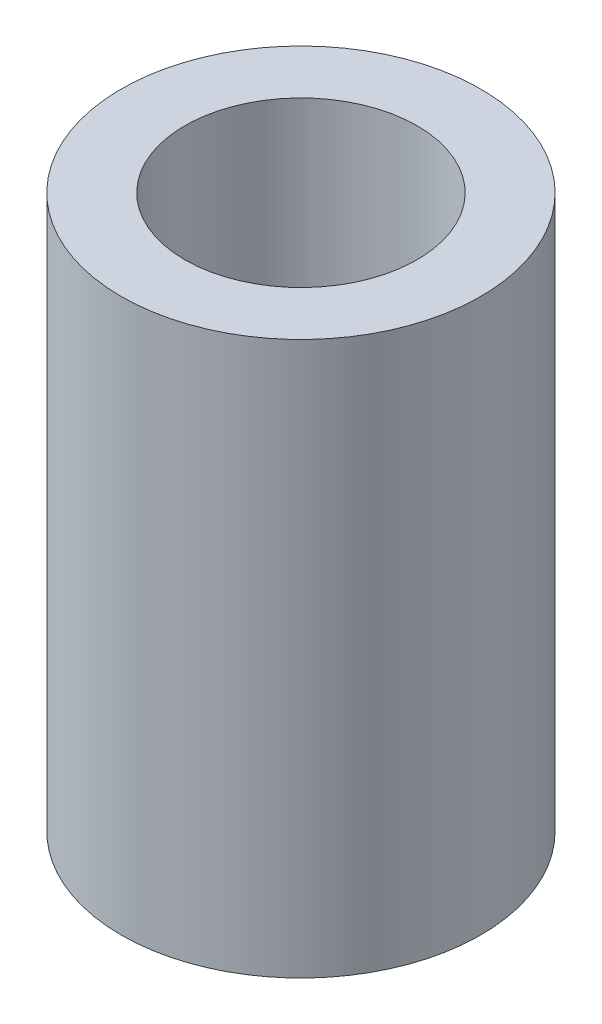
ISO-10303-21;
HEADER;
FILE_DESCRIPTION(('STEP AP214'),'2;1');
FILE_NAME('part.step','',(''),(''),'','','');
FILE_SCHEMA(('AUTOMOTIVE_DESIGN { 1 0 10303 214 1 1 1 1 }'));
ENDSEC;
DATA;
#1=APPLICATION_CONTEXT('core data for automotive mechanical design processes');
#2=APPLICATION_PROTOCOL_DEFINITION('international standard','automotive_design',2000,#1);
#3=PRODUCT_CONTEXT('',#1,'mechanical');
#4=PRODUCT('Part','Part','',(#3));
#5=PRODUCT_RELATED_PRODUCT_CATEGORY('part','',(#4));
#6=PRODUCT_DEFINITION_FORMATION('','',#4);
#7=PRODUCT_DEFINITION_CONTEXT('part definition',#1,'design');
#8=PRODUCT_DEFINITION('design','',#6,#7);
#9=PRODUCT_DEFINITION_SHAPE('','',#8);
#10=(LENGTH_UNIT() NAMED_UNIT(*) SI_UNIT(.MILLI.,.METRE.));
#11=(NAMED_UNIT(*) PLANE_ANGLE_UNIT() SI_UNIT($,.RADIAN.));
#12=(NAMED_UNIT(*) SI_UNIT($,.STERADIAN.) SOLID_ANGLE_UNIT());
#13=UNCERTAINTY_MEASURE_WITH_UNIT(LENGTH_MEASURE(1.E-05),#10,'distance_accuracy_value','');
#14=(GEOMETRIC_REPRESENTATION_CONTEXT(3) GLOBAL_UNCERTAINTY_ASSIGNED_CONTEXT((#13)) GLOBAL_UNIT_ASSIGNED_CONTEXT((#10,
#11,#12)) REPRESENTATION_CONTEXT('',''));
#15=CARTESIAN_POINT('',(0.,0.,0.));
#16=DIRECTION('',(0.,0.,1.));
#17=DIRECTION('',(1.,0.,0.));
#18=AXIS2_PLACEMENT_3D('',#15,#16,#17);
#19=CARTESIAN_POINT('',(0.,10.,0.));
#20=DIRECTION('',(0.,1.,0.));
#21=DIRECTION('',(0.,0.,1.));
#22=AXIS2_PLACEMENT_3D('',#19,#20,#21);
#23=PLANE('',#22);
#24=CARTESIAN_POINT('',(0.,10.,0.));
#25=DIRECTION('',(0.,1.,0.));
#26=DIRECTION('',(0.,0.,1.));
#27=AXIS2_PLACEMENT_3D('',#24,#25,#26);
#28=CIRCLE('',#27,3.25);
#29=CARTESIAN_POINT('',(0.,10.,3.25));
#30=VERTEX_POINT('',#29);
#31=EDGE_CURVE('E10',#30,#30,#28,.T.);
#32=ORIENTED_EDGE('',*,*,#31,.T.);
#33=EDGE_LOOP('',(#32));
#34=FACE_BOUND('',#33,.T.);
#35=CARTESIAN_POINT('',(0.,10.,0.));
#36=DIRECTION('',(0.,1.,0.));
#37=DIRECTION('',(0.,0.,1.));
#38=AXIS2_PLACEMENT_3D('',#35,#36,#37);
#39=CIRCLE('',#38,2.1);
#40=CARTESIAN_POINT('',(0.,10.,2.1));
#41=VERTEX_POINT('',#40);
#42=EDGE_CURVE('E56',#41,#41,#39,.T.);
#43=ORIENTED_EDGE('',*,*,#42,.F.);
#44=EDGE_LOOP('',(#43));
#45=FACE_BOUND('',#44,.T.);
#46=ADVANCED_FACE('F43',(#34,#45),#23,.T.);
#47=CARTESIAN_POINT('',(0.,0.,0.));
#48=DIRECTION('',(0.,1.,0.));
#49=DIRECTION('',(0.,0.,1.));
#50=AXIS2_PLACEMENT_3D('',#47,#48,#49);
#51=PLANE('',#50);
#52=CARTESIAN_POINT('',(0.,0.,0.));
#53=DIRECTION('',(0.,1.,0.));
#54=DIRECTION('',(0.,0.,1.));
#55=AXIS2_PLACEMENT_3D('',#52,#53,#54);
#56=CIRCLE('',#55,3.25);
#57=CARTESIAN_POINT('',(0.,0.,3.25));
#58=VERTEX_POINT('',#57);
#59=EDGE_CURVE('E47',#58,#58,#56,.T.);
#60=ORIENTED_EDGE('',*,*,#59,.F.);
#61=EDGE_LOOP('',(#60));
#62=FACE_BOUND('',#61,.T.);
#63=CARTESIAN_POINT('',(0.,0.,0.));
#64=DIRECTION('',(0.,1.,0.));
#65=DIRECTION('',(0.,0.,1.));
#66=AXIS2_PLACEMENT_3D('',#63,#64,#65);
#67=CIRCLE('',#66,2.1);
#68=CARTESIAN_POINT('',(0.,0.,2.1));
#69=VERTEX_POINT('',#68);
#70=EDGE_CURVE('E58',#69,#69,#67,.T.);
#71=ORIENTED_EDGE('',*,*,#70,.T.);
#72=EDGE_LOOP('',(#71));
#73=FACE_BOUND('',#72,.T.);
#74=ADVANCED_FACE('F70',(#62,#73),#51,.F.);
#75=CARTESIAN_POINT('',(0.,10.,0.));
#76=DIRECTION('',(0.,-1.,0.));
#77=DIRECTION('',(0.,0.,-1.));
#78=AXIS2_PLACEMENT_3D('',#75,#76,#77);
#79=CYLINDRICAL_SURFACE('',#78,3.25);
#80=ORIENTED_EDGE('',*,*,#31,.F.);
#81=EDGE_LOOP('',(#80));
#82=FACE_BOUND('',#81,.T.);
#83=ORIENTED_EDGE('',*,*,#59,.T.);
#84=EDGE_LOOP('',(#83));
#85=FACE_BOUND('',#84,.T.);
#86=ADVANCED_FACE('F45',(#82,#85),#79,.T.);
#87=CARTESIAN_POINT('',(0.,10.,0.));
#88=DIRECTION('',(0.,-1.,0.));
#89=DIRECTION('',(0.,0.,-1.));
#90=AXIS2_PLACEMENT_3D('',#87,#88,#89);
#91=CYLINDRICAL_SURFACE('',#90,2.1);
#92=ORIENTED_EDGE('',*,*,#42,.T.);
#93=EDGE_LOOP('',(#92));
#94=FACE_BOUND('',#93,.T.);
#95=ORIENTED_EDGE('',*,*,#70,.F.);
#96=EDGE_LOOP('',(#95));
#97=FACE_BOUND('',#96,.T.);
#98=ADVANCED_FACE('F66',(#94,#97),#91,.F.);
#99=CLOSED_SHELL('',(#46,#74,#86,#98));
#100=MANIFOLD_SOLID_BREP('B2',#99);
#101=ADVANCED_BREP_SHAPE_REPRESENTATION('',(#18,#100),#14);
#102=SHAPE_DEFINITION_REPRESENTATION(#9,#101);
ENDSEC;
END-ISO-10303-21;
